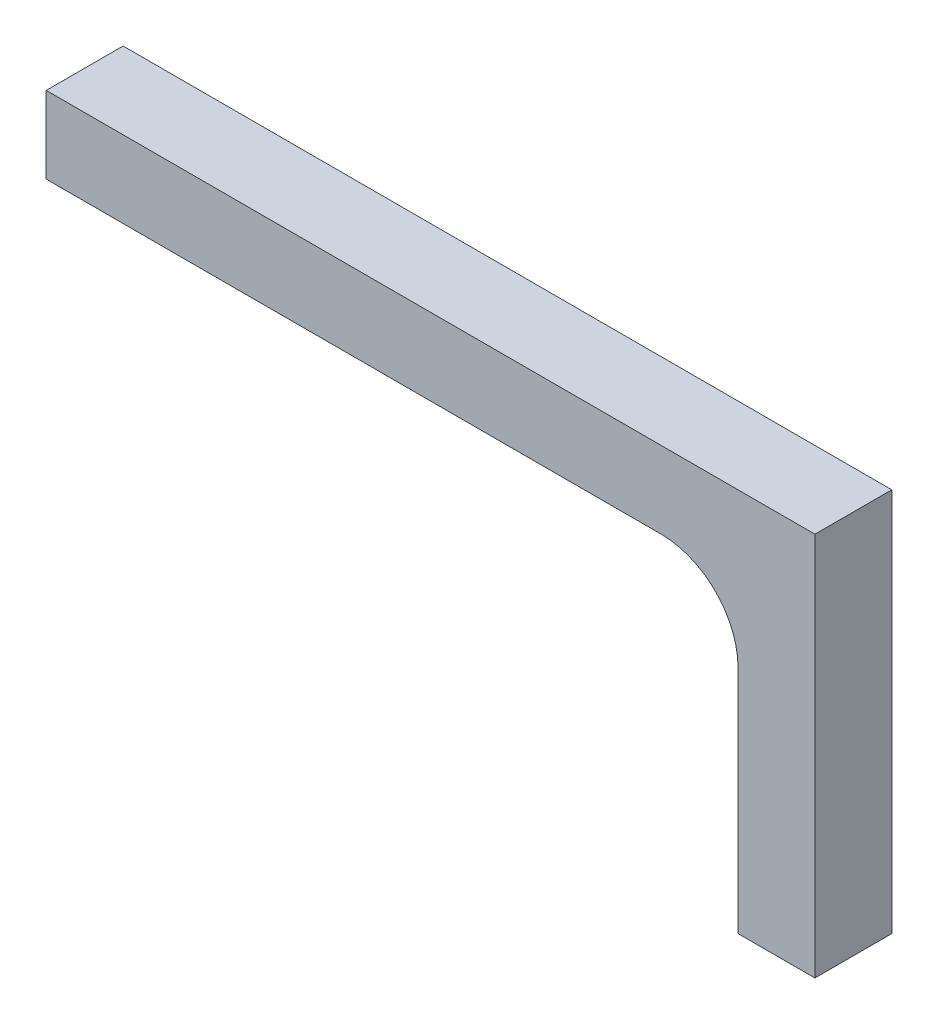
ISO-10303-21;
HEADER;
FILE_DESCRIPTION(('STEP AP214'),'2;1');
FILE_NAME('part.step','',(''),(''),'','','');
FILE_SCHEMA(('AUTOMOTIVE_DESIGN { 1 0 10303 214 1 1 1 1 }'));
ENDSEC;
DATA;
#1=APPLICATION_CONTEXT('core data for automotive mechanical design processes');
#2=APPLICATION_PROTOCOL_DEFINITION('international standard','automotive_design',2000,#1);
#3=PRODUCT_CONTEXT('',#1,'mechanical');
#4=PRODUCT('Part','Part','',(#3));
#5=PRODUCT_RELATED_PRODUCT_CATEGORY('part','',(#4));
#6=PRODUCT_DEFINITION_FORMATION('','',#4);
#7=PRODUCT_DEFINITION_CONTEXT('part definition',#1,'design');
#8=PRODUCT_DEFINITION('design','',#6,#7);
#9=PRODUCT_DEFINITION_SHAPE('','',#8);
#10=(LENGTH_UNIT() NAMED_UNIT(*) SI_UNIT(.MILLI.,.METRE.));
#11=(NAMED_UNIT(*) PLANE_ANGLE_UNIT() SI_UNIT($,.RADIAN.));
#12=(NAMED_UNIT(*) SI_UNIT($,.STERADIAN.) SOLID_ANGLE_UNIT());
#13=UNCERTAINTY_MEASURE_WITH_UNIT(LENGTH_MEASURE(1.E-05),#10,'distance_accuracy_value','');
#14=(GEOMETRIC_REPRESENTATION_CONTEXT(3) GLOBAL_UNCERTAINTY_ASSIGNED_CONTEXT((#13)) GLOBAL_UNIT_ASSIGNED_CONTEXT((#10,
#11,#12)) REPRESENTATION_CONTEXT('',''));
#15=CARTESIAN_POINT('',(0.,0.,0.));
#16=DIRECTION('',(0.,0.,1.));
#17=DIRECTION('',(1.,0.,0.));
#18=AXIS2_PLACEMENT_3D('',#15,#16,#17);
#19=CARTESIAN_POINT('',(90.,0.,10.));
#20=DIRECTION('',(0.,1.,0.));
#21=DIRECTION('',(-1.,0.,0.));
#22=AXIS2_PLACEMENT_3D('',#19,#20,#21);
#23=PLANE('',#22);
#24=DIRECTION('',(1.,0.,0.));
#25=VECTOR('',#24,1.);
#26=CARTESIAN_POINT('',(90.,0.,0.));
#27=LINE('',#26,#25);
#28=CARTESIAN_POINT('',(0.,0.,0.));
#29=VERTEX_POINT('',#28);
#30=CARTESIAN_POINT('',(80.,0.,0.));
#31=VERTEX_POINT('',#30);
#32=EDGE_CURVE('E129',#29,#31,#27,.T.);
#33=ORIENTED_EDGE('',*,*,#32,.T.);
#34=DIRECTION('',(0.,0.,-1.));
#35=VECTOR('',#34,1.);
#36=CARTESIAN_POINT('',(80.,0.,10.));
#37=LINE('',#36,#35);
#38=CARTESIAN_POINT('',(80.,0.,10.));
#39=VERTEX_POINT('',#38);
#40=EDGE_CURVE('E52',#31,#39,#37,.F.);
#41=ORIENTED_EDGE('',*,*,#40,.T.);
#42=DIRECTION('',(1.,0.,0.));
#43=VECTOR('',#42,1.);
#44=CARTESIAN_POINT('',(90.,0.,10.));
#45=LINE('',#44,#43);
#46=CARTESIAN_POINT('',(0.,0.,10.));
#47=VERTEX_POINT('',#46);
#48=EDGE_CURVE('E105',#47,#39,#45,.T.);
#49=ORIENTED_EDGE('',*,*,#48,.F.);
#50=DIRECTION('',(0.,0.,-1.));
#51=VECTOR('',#50,1.);
#52=CARTESIAN_POINT('',(0.,0.,10.));
#53=LINE('',#52,#51);
#54=EDGE_CURVE('E128',#47,#29,#53,.T.);
#55=ORIENTED_EDGE('',*,*,#54,.T.);
#56=EDGE_LOOP('',(#33,#41,#49,#55));
#57=FACE_BOUND('',#56,.T.);
#58=ADVANCED_FACE('F37',(#57),#23,.F.);
#59=CARTESIAN_POINT('',(90.,-40.,10.));
#60=DIRECTION('',(1.,0.,0.));
#61=DIRECTION('',(0.,0.,-1.));
#62=AXIS2_PLACEMENT_3D('',#59,#60,#61);
#63=PLANE('',#62);
#64=DIRECTION('',(0.,-1.,0.));
#65=VECTOR('',#64,1.);
#66=CARTESIAN_POINT('',(90.,-40.,10.));
#67=LINE('',#66,#65);
#68=CARTESIAN_POINT('',(90.,-10.,10.));
#69=VERTEX_POINT('',#68);
#70=CARTESIAN_POINT('',(90.,-40.,10.));
#71=VERTEX_POINT('',#70);
#72=EDGE_CURVE('E95',#69,#71,#67,.T.);
#73=ORIENTED_EDGE('',*,*,#72,.F.);
#74=DIRECTION('',(0.,0.,-1.));
#75=VECTOR('',#74,1.);
#76=CARTESIAN_POINT('',(90.,-10.,0.));
#77=LINE('',#76,#75);
#78=CARTESIAN_POINT('',(90.,-10.,0.));
#79=VERTEX_POINT('',#78);
#80=EDGE_CURVE('E113',#69,#79,#77,.T.);
#81=ORIENTED_EDGE('',*,*,#80,.T.);
#82=DIRECTION('',(0.,-1.,0.));
#83=VECTOR('',#82,1.);
#84=CARTESIAN_POINT('',(90.,-40.,0.));
#85=LINE('',#84,#83);
#86=CARTESIAN_POINT('',(90.,-40.,0.));
#87=VERTEX_POINT('',#86);
#88=EDGE_CURVE('E110',#79,#87,#85,.T.);
#89=ORIENTED_EDGE('',*,*,#88,.T.);
#90=DIRECTION('',(0.,0.,-1.));
#91=VECTOR('',#90,1.);
#92=CARTESIAN_POINT('',(90.,-40.,10.));
#93=LINE('',#92,#91);
#94=EDGE_CURVE('E108',#71,#87,#93,.T.);
#95=ORIENTED_EDGE('',*,*,#94,.F.);
#96=EDGE_LOOP('',(#73,#81,#89,#95));
#97=FACE_BOUND('',#96,.T.);
#98=ADVANCED_FACE('F109',(#97),#63,.F.);
#99=CARTESIAN_POINT('',(100.,-40.,10.));
#100=DIRECTION('',(0.,1.,0.));
#101=DIRECTION('',(0.,0.,1.));
#102=AXIS2_PLACEMENT_3D('',#99,#100,#101);
#103=PLANE('',#102);
#104=DIRECTION('',(1.,0.,0.));
#105=VECTOR('',#104,1.);
#106=CARTESIAN_POINT('',(100.,-40.,0.));
#107=LINE('',#106,#105);
#108=CARTESIAN_POINT('',(100.,-40.,0.));
#109=VERTEX_POINT('',#108);
#110=EDGE_CURVE('E132',#87,#109,#107,.T.);
#111=ORIENTED_EDGE('',*,*,#110,.T.);
#112=DIRECTION('',(0.,0.,-1.));
#113=VECTOR('',#112,1.);
#114=CARTESIAN_POINT('',(100.,-40.,10.));
#115=LINE('',#114,#113);
#116=CARTESIAN_POINT('',(100.,-40.,10.));
#117=VERTEX_POINT('',#116);
#118=EDGE_CURVE('E114',#117,#109,#115,.T.);
#119=ORIENTED_EDGE('',*,*,#118,.F.);
#120=DIRECTION('',(1.,0.,0.));
#121=VECTOR('',#120,1.);
#122=CARTESIAN_POINT('',(100.,-40.,10.));
#123=LINE('',#122,#121);
#124=EDGE_CURVE('E99',#71,#117,#123,.T.);
#125=ORIENTED_EDGE('',*,*,#124,.F.);
#126=ORIENTED_EDGE('',*,*,#94,.T.);
#127=EDGE_LOOP('',(#111,#119,#125,#126));
#128=FACE_BOUND('',#127,.T.);
#129=ADVANCED_FACE('F116',(#128),#103,.F.);
#130=CARTESIAN_POINT('',(100.,10.,10.));
#131=DIRECTION('',(-1.,0.,0.));
#132=DIRECTION('',(0.,-1.,0.));
#133=AXIS2_PLACEMENT_3D('',#130,#131,#132);
#134=PLANE('',#133);
#135=DIRECTION('',(0.,1.,0.));
#136=VECTOR('',#135,1.);
#137=CARTESIAN_POINT('',(100.,10.,0.));
#138=LINE('',#137,#136);
#139=CARTESIAN_POINT('',(100.,10.,0.));
#140=VERTEX_POINT('',#139);
#141=EDGE_CURVE('E134',#109,#140,#138,.T.);
#142=ORIENTED_EDGE('',*,*,#141,.T.);
#143=DIRECTION('',(0.,0.,-1.));
#144=VECTOR('',#143,1.);
#145=CARTESIAN_POINT('',(100.,10.,10.));
#146=LINE('',#145,#144);
#147=CARTESIAN_POINT('',(100.,10.,10.));
#148=VERTEX_POINT('',#147);
#149=EDGE_CURVE('E145',#148,#140,#146,.T.);
#150=ORIENTED_EDGE('',*,*,#149,.F.);
#151=DIRECTION('',(0.,1.,0.));
#152=VECTOR('',#151,1.);
#153=CARTESIAN_POINT('',(100.,10.,10.));
#154=LINE('',#153,#152);
#155=EDGE_CURVE('E119',#117,#148,#154,.T.);
#156=ORIENTED_EDGE('',*,*,#155,.F.);
#157=ORIENTED_EDGE('',*,*,#118,.T.);
#158=EDGE_LOOP('',(#142,#150,#156,#157));
#159=FACE_BOUND('',#158,.T.);
#160=ADVANCED_FACE('F155',(#159),#134,.F.);
#161=CARTESIAN_POINT('',(0.,10.,10.));
#162=DIRECTION('',(0.,-1.,0.));
#163=DIRECTION('',(0.,0.,-1.));
#164=AXIS2_PLACEMENT_3D('',#161,#162,#163);
#165=PLANE('',#164);
#166=DIRECTION('',(-1.,0.,0.));
#167=VECTOR('',#166,1.);
#168=CARTESIAN_POINT('',(0.,10.,0.));
#169=LINE('',#168,#167);
#170=CARTESIAN_POINT('',(0.,10.,0.));
#171=VERTEX_POINT('',#170);
#172=EDGE_CURVE('E136',#140,#171,#169,.T.);
#173=ORIENTED_EDGE('',*,*,#172,.T.);
#174=DIRECTION('',(0.,0.,-1.));
#175=VECTOR('',#174,1.);
#176=CARTESIAN_POINT('',(0.,10.,10.));
#177=LINE('',#176,#175);
#178=CARTESIAN_POINT('',(0.,10.,10.));
#179=VERTEX_POINT('',#178);
#180=EDGE_CURVE('E142',#179,#171,#177,.T.);
#181=ORIENTED_EDGE('',*,*,#180,.F.);
#182=DIRECTION('',(-1.,0.,0.));
#183=VECTOR('',#182,1.);
#184=CARTESIAN_POINT('',(0.,10.,10.));
#185=LINE('',#184,#183);
#186=EDGE_CURVE('E121',#148,#179,#185,.T.);
#187=ORIENTED_EDGE('',*,*,#186,.F.);
#188=ORIENTED_EDGE('',*,*,#149,.T.);
#189=EDGE_LOOP('',(#173,#181,#187,#188));
#190=FACE_BOUND('',#189,.T.);
#191=ADVANCED_FACE('F162',(#190),#165,.F.);
#192=CARTESIAN_POINT('',(0.,0.,10.));
#193=DIRECTION('',(1.,0.,0.));
#194=DIRECTION('',(0.,0.,-1.));
#195=AXIS2_PLACEMENT_3D('',#192,#193,#194);
#196=PLANE('',#195);
#197=DIRECTION('',(0.,-1.,0.));
#198=VECTOR('',#197,1.);
#199=CARTESIAN_POINT('',(0.,0.,0.));
#200=LINE('',#199,#198);
#201=EDGE_CURVE('E138',#171,#29,#200,.T.);
#202=ORIENTED_EDGE('',*,*,#201,.T.);
#203=ORIENTED_EDGE('',*,*,#54,.F.);
#204=DIRECTION('',(0.,-1.,0.));
#205=VECTOR('',#204,1.);
#206=CARTESIAN_POINT('',(0.,0.,10.));
#207=LINE('',#206,#205);
#208=EDGE_CURVE('E126',#179,#47,#207,.T.);
#209=ORIENTED_EDGE('',*,*,#208,.F.);
#210=ORIENTED_EDGE('',*,*,#180,.T.);
#211=EDGE_LOOP('',(#202,#203,#209,#210));
#212=FACE_BOUND('',#211,.T.);
#213=ADVANCED_FACE('F165',(#212),#196,.F.);
#214=CARTESIAN_POINT('',(0.,0.,10.));
#215=DIRECTION('',(0.,0.,-1.));
#216=DIRECTION('',(-1.,0.,0.));
#217=AXIS2_PLACEMENT_3D('',#214,#215,#216);
#218=PLANE('',#217);
#219=ORIENTED_EDGE('',*,*,#48,.T.);
#220=CARTESIAN_POINT('',(80.,-10.,10.));
#221=DIRECTION('',(0.,0.,-1.));
#222=DIRECTION('',(-1.,0.,0.));
#223=AXIS2_PLACEMENT_3D('',#220,#221,#222);
#224=CIRCLE('',#223,10.);
#225=EDGE_CURVE('E11',#39,#69,#224,.T.);
#226=ORIENTED_EDGE('',*,*,#225,.T.);
#227=ORIENTED_EDGE('',*,*,#72,.T.);
#228=ORIENTED_EDGE('',*,*,#124,.T.);
#229=ORIENTED_EDGE('',*,*,#155,.T.);
#230=ORIENTED_EDGE('',*,*,#186,.T.);
#231=ORIENTED_EDGE('',*,*,#208,.T.);
#232=EDGE_LOOP('',(#219,#226,#227,#228,#229,#230,#231));
#233=FACE_BOUND('',#232,.T.);
#234=ADVANCED_FACE('F97',(#233),#218,.F.);
#235=CARTESIAN_POINT('',(0.,0.,0.));
#236=DIRECTION('',(0.,0.,-1.));
#237=DIRECTION('',(-1.,0.,0.));
#238=AXIS2_PLACEMENT_3D('',#235,#236,#237);
#239=PLANE('',#238);
#240=ORIENTED_EDGE('',*,*,#32,.F.);
#241=ORIENTED_EDGE('',*,*,#201,.F.);
#242=ORIENTED_EDGE('',*,*,#172,.F.);
#243=ORIENTED_EDGE('',*,*,#141,.F.);
#244=ORIENTED_EDGE('',*,*,#110,.F.);
#245=ORIENTED_EDGE('',*,*,#88,.F.);
#246=CARTESIAN_POINT('',(80.,-10.,0.));
#247=DIRECTION('',(0.,0.,-1.));
#248=DIRECTION('',(-1.,0.,0.));
#249=AXIS2_PLACEMENT_3D('',#246,#247,#248);
#250=CIRCLE('',#249,10.);
#251=EDGE_CURVE('E45',#79,#31,#250,.F.);
#252=ORIENTED_EDGE('',*,*,#251,.T.);
#253=EDGE_LOOP('',(#240,#241,#242,#243,#244,#245,#252));
#254=FACE_BOUND('',#253,.T.);
#255=ADVANCED_FACE('F151',(#254),#239,.T.);
#256=CARTESIAN_POINT('',(80.,-10.,10.));
#257=DIRECTION('',(0.,0.,1.));
#258=DIRECTION('',(1.,0.,0.));
#259=AXIS2_PLACEMENT_3D('',#256,#257,#258);
#260=CYLINDRICAL_SURFACE('',#259,10.);
#261=ORIENTED_EDGE('',*,*,#225,.F.);
#262=ORIENTED_EDGE('',*,*,#40,.F.);
#263=ORIENTED_EDGE('',*,*,#251,.F.);
#264=ORIENTED_EDGE('',*,*,#80,.F.);
#265=EDGE_LOOP('',(#261,#262,#263,#264));
#266=FACE_BOUND('',#265,.T.);
#267=ADVANCED_FACE('F39',(#266),#260,.F.);
#268=CLOSED_SHELL('',(#58,#98,#129,#160,#191,#213,#234,#255,#267));
#269=MANIFOLD_SOLID_BREP('B2',#268);
#270=ADVANCED_BREP_SHAPE_REPRESENTATION('',(#18,#269),#14);
#271=SHAPE_DEFINITION_REPRESENTATION(#9,#270);
ENDSEC;
END-ISO-10303-21;
